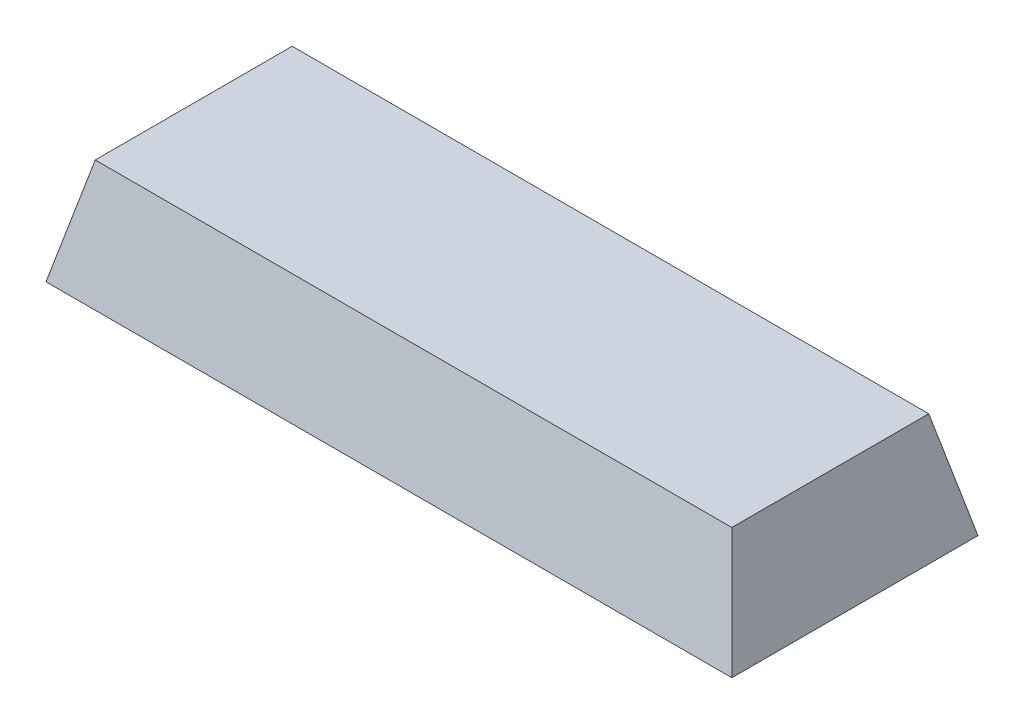
ISO-10303-21;
HEADER;
FILE_DESCRIPTION(('STEP AP214'),'2;1');
FILE_NAME('part.step','',(''),(''),'','','');
FILE_SCHEMA(('AUTOMOTIVE_DESIGN { 1 0 10303 214 1 1 1 1 }'));
ENDSEC;
DATA;
#1=APPLICATION_CONTEXT('core data for automotive mechanical design processes');
#2=APPLICATION_PROTOCOL_DEFINITION('international standard','automotive_design',2000,#1);
#3=PRODUCT_CONTEXT('',#1,'mechanical');
#4=PRODUCT('Part','Part','',(#3));
#5=PRODUCT_RELATED_PRODUCT_CATEGORY('part','',(#4));
#6=PRODUCT_DEFINITION_FORMATION('','',#4);
#7=PRODUCT_DEFINITION_CONTEXT('part definition',#1,'design');
#8=PRODUCT_DEFINITION('design','',#6,#7);
#9=PRODUCT_DEFINITION_SHAPE('','',#8);
#10=(LENGTH_UNIT() NAMED_UNIT(*) SI_UNIT(.MILLI.,.METRE.));
#11=(NAMED_UNIT(*) PLANE_ANGLE_UNIT() SI_UNIT($,.RADIAN.));
#12=(NAMED_UNIT(*) SI_UNIT($,.STERADIAN.) SOLID_ANGLE_UNIT());
#13=UNCERTAINTY_MEASURE_WITH_UNIT(LENGTH_MEASURE(1.E-05),#10,'distance_accuracy_value','');
#14=(GEOMETRIC_REPRESENTATION_CONTEXT(3) GLOBAL_UNCERTAINTY_ASSIGNED_CONTEXT((#13)) GLOBAL_UNIT_ASSIGNED_CONTEXT((#10,
#11,#12)) REPRESENTATION_CONTEXT('',''));
#15=CARTESIAN_POINT('',(0.,0.,0.));
#16=DIRECTION('',(0.,0.,1.));
#17=DIRECTION('',(1.,0.,0.));
#18=AXIS2_PLACEMENT_3D('',#15,#16,#17);
#19=CARTESIAN_POINT('',(0.,3.,0.));
#20=DIRECTION('',(0.,-1.,0.));
#21=DIRECTION('',(0.,0.,-1.));
#22=AXIS2_PLACEMENT_3D('',#19,#20,#21);
#23=PLANE('',#22);
#24=DIRECTION('',(-1.,0.,0.));
#25=VECTOR('',#24,1.);
#26=CARTESIAN_POINT('',(19.5,3.,-0.7));
#27=LINE('',#26,#25);
#28=CARTESIAN_POINT('',(18.8,3.,-0.7));
#29=VERTEX_POINT('',#28);
#30=CARTESIAN_POINT('',(0.7,3.,-0.7));
#31=VERTEX_POINT('',#30);
#32=EDGE_CURVE('E60',#29,#31,#27,.T.);
#33=ORIENTED_EDGE('',*,*,#32,.F.);
#34=DIRECTION('',(0.,0.,1.));
#35=VECTOR('',#34,1.);
#36=CARTESIAN_POINT('',(18.8,3.,-7.));
#37=LINE('',#36,#35);
#38=CARTESIAN_POINT('',(18.8,3.,-6.3));
#39=VERTEX_POINT('',#38);
#40=EDGE_CURVE('E117',#39,#29,#37,.T.);
#41=ORIENTED_EDGE('',*,*,#40,.F.);
#42=DIRECTION('',(-1.,0.,0.));
#43=VECTOR('',#42,1.);
#44=CARTESIAN_POINT('',(19.5,3.,-6.3));
#45=LINE('',#44,#43);
#46=CARTESIAN_POINT('',(0.699999999999998,3.,-6.3));
#47=VERTEX_POINT('',#46);
#48=EDGE_CURVE('E129',#39,#47,#45,.T.);
#49=ORIENTED_EDGE('',*,*,#48,.T.);
#50=DIRECTION('',(0.,0.,1.));
#51=VECTOR('',#50,1.);
#52=CARTESIAN_POINT('',(0.7,3.,-7.));
#53=LINE('',#52,#51);
#54=EDGE_CURVE('E96',#47,#31,#53,.T.);
#55=ORIENTED_EDGE('',*,*,#54,.T.);
#56=EDGE_LOOP('',(#33,#41,#49,#55));
#57=FACE_BOUND('',#56,.T.);
#58=ADVANCED_FACE('F43',(#57),#23,.F.);
#59=CARTESIAN_POINT('',(19.5,0.,-7.));
#60=DIRECTION('',(-0.973841209741793,-0.227229615606418,0.));
#61=DIRECTION('',(0.227229615606418,-0.973841209741793,0.));
#62=AXIS2_PLACEMENT_3D('',#59,#60,#61);
#63=PLANE('',#62);
#64=DIRECTION('',(-0.221581128241521,0.949633406749378,-0.221581128241521));
#65=VECTOR('',#64,1.);
#66=CARTESIAN_POINT('',(19.1563126252505,1.47294589178357,-0.343687374749499));
#67=LINE('',#66,#65);
#68=CARTESIAN_POINT('',(19.5,0.,0.));
#69=VERTEX_POINT('',#68);
#70=EDGE_CURVE('E121',#69,#29,#67,.T.);
#71=ORIENTED_EDGE('',*,*,#70,.F.);
#72=DIRECTION('',(0.,0.,-1.));
#73=VECTOR('',#72,1.);
#74=CARTESIAN_POINT('',(19.5,0.,0.));
#75=LINE('',#74,#73);
#76=CARTESIAN_POINT('',(19.5,0.,-7.));
#77=VERTEX_POINT('',#76);
#78=EDGE_CURVE('E100',#69,#77,#75,.T.);
#79=ORIENTED_EDGE('',*,*,#78,.T.);
#80=DIRECTION('',(0.221581128241521,-0.949633406749378,-0.221581128241521));
#81=VECTOR('',#80,1.);
#82=CARTESIAN_POINT('',(19.5,0.,-7.));
#83=LINE('',#82,#81);
#84=EDGE_CURVE('E126',#39,#77,#83,.T.);
#85=ORIENTED_EDGE('',*,*,#84,.F.);
#86=ORIENTED_EDGE('',*,*,#40,.T.);
#87=EDGE_LOOP('',(#71,#79,#85,#86));
#88=FACE_BOUND('',#87,.T.);
#89=ADVANCED_FACE('F159',(#88),#63,.F.);
#90=CARTESIAN_POINT('',(0.,0.,-7.));
#91=DIRECTION('',(0.973841209741793,-0.227229615606418,0.));
#92=DIRECTION('',(0.227229615606418,0.973841209741793,0.));
#93=AXIS2_PLACEMENT_3D('',#90,#91,#92);
#94=PLANE('',#93);
#95=DIRECTION('',(-0.221581128241521,-0.949633406749378,0.221581128241521));
#96=VECTOR('',#95,1.);
#97=CARTESIAN_POINT('',(0.343687374749499,1.47294589178357,-0.3436873747495));
#98=LINE('',#97,#96);
#99=CARTESIAN_POINT('',(-6.E-06,0.,0.));
#100=VERTEX_POINT('',#99);
#101=EDGE_CURVE('E11',#31,#100,#98,.T.);
#102=ORIENTED_EDGE('',*,*,#101,.F.);
#103=ORIENTED_EDGE('',*,*,#54,.F.);
#104=DIRECTION('',(0.221581128241521,0.949633406749378,0.221581128241521));
#105=VECTOR('',#104,1.);
#106=CARTESIAN_POINT('',(0.,0.,-7.));
#107=LINE('',#106,#105);
#108=CARTESIAN_POINT('',(0.,0.,-7.));
#109=VERTEX_POINT('',#108);
#110=EDGE_CURVE('E53',#109,#47,#107,.T.);
#111=ORIENTED_EDGE('',*,*,#110,.F.);
#112=DIRECTION('',(0.,0.,1.));
#113=VECTOR('',#112,1.);
#114=CARTESIAN_POINT('',(0.,0.,0.));
#115=LINE('',#114,#113);
#116=EDGE_CURVE('E92',#109,#100,#115,.T.);
#117=ORIENTED_EDGE('',*,*,#116,.T.);
#118=EDGE_LOOP('',(#102,#103,#111,#117));
#119=FACE_BOUND('',#118,.T.);
#120=ADVANCED_FACE('F93',(#119),#94,.F.);
#121=CARTESIAN_POINT('',(0.,0.,0.));
#122=DIRECTION('',(0.,-1.,0.));
#123=DIRECTION('',(0.,0.,-1.));
#124=AXIS2_PLACEMENT_3D('',#121,#122,#123);
#125=PLANE('',#124);
#126=CARTESIAN_POINT('',(9.75,0.,-3.5));
#127=DIRECTION('',(0.,-1.,0.));
#128=DIRECTION('',(0.,0.,-1.));
#129=AXIS2_PLACEMENT_3D('',#126,#127,#128);
#130=CIRCLE('',#129,1.8);
#131=CARTESIAN_POINT('',(9.75,0.,-5.3));
#132=VERTEX_POINT('',#131);
#133=EDGE_CURVE('E136',#132,#132,#130,.T.);
#134=ORIENTED_EDGE('',*,*,#133,.F.);
#135=EDGE_LOOP('',(#134));
#136=FACE_BOUND('',#135,.T.);
#137=ORIENTED_EDGE('',*,*,#116,.F.);
#138=DIRECTION('',(-1.,0.,0.));
#139=VECTOR('',#138,1.);
#140=CARTESIAN_POINT('',(0.,0.,-7.));
#141=LINE('',#140,#139);
#142=EDGE_CURVE('E68',#77,#109,#141,.T.);
#143=ORIENTED_EDGE('',*,*,#142,.F.);
#144=ORIENTED_EDGE('',*,*,#78,.F.);
#145=DIRECTION('',(1.,0.,0.));
#146=VECTOR('',#145,1.);
#147=CARTESIAN_POINT('',(0.,0.,0.));
#148=LINE('',#147,#146);
#149=EDGE_CURVE('E86',#100,#69,#148,.T.);
#150=ORIENTED_EDGE('',*,*,#149,.F.);
#151=EDGE_LOOP('',(#137,#143,#144,#150));
#152=FACE_BOUND('',#151,.T.);
#153=ADVANCED_FACE('F45',(#136,#152),#125,.T.);
#154=CARTESIAN_POINT('',(19.5,3.,-6.3));
#155=DIRECTION('',(0.,0.227229615606418,-0.973841209741793));
#156=DIRECTION('',(0.,0.973841209741793,0.227229615606418));
#157=AXIS2_PLACEMENT_3D('',#154,#155,#156);
#158=PLANE('',#157);
#159=ORIENTED_EDGE('',*,*,#84,.T.);
#160=ORIENTED_EDGE('',*,*,#142,.T.);
#161=ORIENTED_EDGE('',*,*,#110,.T.);
#162=ORIENTED_EDGE('',*,*,#48,.F.);
#163=EDGE_LOOP('',(#159,#160,#161,#162));
#164=FACE_BOUND('',#163,.T.);
#165=ADVANCED_FACE('F153',(#164),#158,.T.);
#166=CARTESIAN_POINT('',(19.5,0.,0.));
#167=DIRECTION('',(0.,0.227229615606418,0.973841209741793));
#168=DIRECTION('',(0.,-0.973841209741793,0.227229615606418));
#169=AXIS2_PLACEMENT_3D('',#166,#167,#168);
#170=PLANE('',#169);
#171=ORIENTED_EDGE('',*,*,#70,.T.);
#172=ORIENTED_EDGE('',*,*,#32,.T.);
#173=ORIENTED_EDGE('',*,*,#101,.T.);
#174=ORIENTED_EDGE('',*,*,#149,.T.);
#175=EDGE_LOOP('',(#171,#172,#173,#174));
#176=FACE_BOUND('',#175,.T.);
#177=ADVANCED_FACE('F84',(#176),#170,.T.);
#178=CARTESIAN_POINT('',(9.75,0.8,-3.5));
#179=DIRECTION('',(0.,-1.,0.));
#180=DIRECTION('',(0.,0.,-1.));
#181=AXIS2_PLACEMENT_3D('',#178,#179,#180);
#182=CYLINDRICAL_SURFACE('',#181,1.8);
#183=CARTESIAN_POINT('',(9.75,0.8,-3.5));
#184=DIRECTION('',(0.,-1.,0.));
#185=DIRECTION('',(0.,0.,-1.));
#186=AXIS2_PLACEMENT_3D('',#183,#184,#185);
#187=CIRCLE('',#186,1.8);
#188=CARTESIAN_POINT('',(9.75,0.8,-5.3));
#189=VERTEX_POINT('',#188);
#190=EDGE_CURVE('E133',#189,#189,#187,.T.);
#191=ORIENTED_EDGE('',*,*,#190,.F.);
#192=EDGE_LOOP('',(#191));
#193=FACE_BOUND('',#192,.T.);
#194=ORIENTED_EDGE('',*,*,#133,.T.);
#195=EDGE_LOOP('',(#194));
#196=FACE_BOUND('',#195,.T.);
#197=ADVANCED_FACE('F146',(#193,#196),#182,.F.);
#198=CARTESIAN_POINT('',(9.75,0.8,-3.5));
#199=DIRECTION('',(0.,-1.,0.));
#200=DIRECTION('',(0.,0.,-1.));
#201=AXIS2_PLACEMENT_3D('',#198,#199,#200);
#202=PLANE('',#201);
#203=ORIENTED_EDGE('',*,*,#190,.T.);
#204=EDGE_LOOP('',(#203));
#205=FACE_BOUND('',#204,.T.);
#206=ADVANCED_FACE('F144',(#205),#202,.T.);
#207=CLOSED_SHELL('',(#58,#89,#120,#153,#165,#177,#197,#206));
#208=MANIFOLD_SOLID_BREP('B2',#207);
#209=ADVANCED_BREP_SHAPE_REPRESENTATION('',(#18,#208),#14);
#210=SHAPE_DEFINITION_REPRESENTATION(#9,#209);
ENDSEC;
END-ISO-10303-21;
